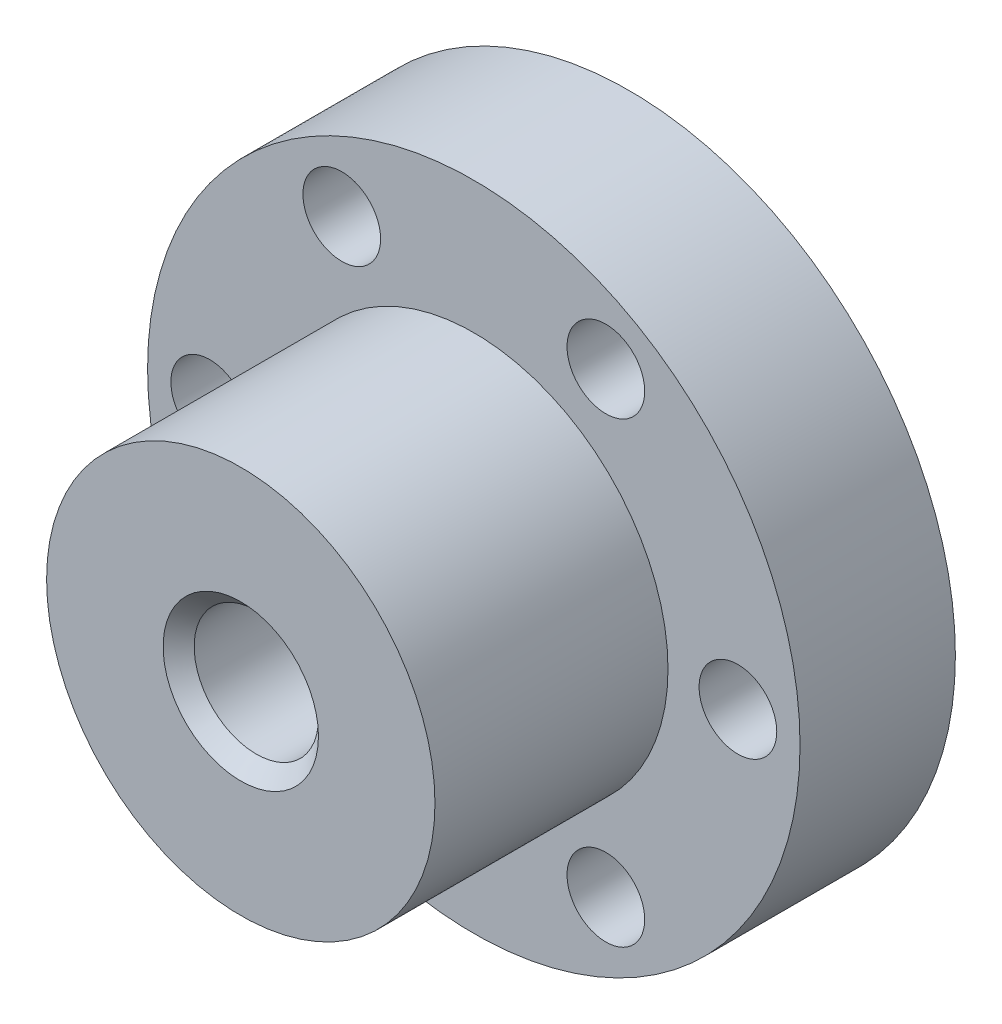
ISO-10303-21;
HEADER;
FILE_DESCRIPTION(('STEP AP214'),'2;1');
FILE_NAME('part.step','',(''),(''),'','','');
FILE_SCHEMA(('AUTOMOTIVE_DESIGN { 1 0 10303 214 1 1 1 1 }'));
ENDSEC;
DATA;
#1=APPLICATION_CONTEXT('core data for automotive mechanical design processes');
#2=APPLICATION_PROTOCOL_DEFINITION('international standard','automotive_design',2000,#1);
#3=PRODUCT_CONTEXT('',#1,'mechanical');
#4=PRODUCT('Part','Part','',(#3));
#5=PRODUCT_RELATED_PRODUCT_CATEGORY('part','',(#4));
#6=PRODUCT_DEFINITION_FORMATION('','',#4);
#7=PRODUCT_DEFINITION_CONTEXT('part definition',#1,'design');
#8=PRODUCT_DEFINITION('design','',#6,#7);
#9=PRODUCT_DEFINITION_SHAPE('','',#8);
#10=(LENGTH_UNIT() NAMED_UNIT(*) SI_UNIT(.MILLI.,.METRE.));
#11=(NAMED_UNIT(*) PLANE_ANGLE_UNIT() SI_UNIT($,.RADIAN.));
#12=(NAMED_UNIT(*) SI_UNIT($,.STERADIAN.) SOLID_ANGLE_UNIT());
#13=UNCERTAINTY_MEASURE_WITH_UNIT(LENGTH_MEASURE(1.E-05),#10,'distance_accuracy_value','');
#14=(GEOMETRIC_REPRESENTATION_CONTEXT(3) GLOBAL_UNCERTAINTY_ASSIGNED_CONTEXT((#13)) GLOBAL_UNIT_ASSIGNED_CONTEXT((#10,
#11,#12)) REPRESENTATION_CONTEXT('',''));
#15=CARTESIAN_POINT('',(0.,0.,0.));
#16=DIRECTION('',(0.,0.,1.));
#17=DIRECTION('',(1.,0.,0.));
#18=AXIS2_PLACEMENT_3D('',#15,#16,#17);
#19=CARTESIAN_POINT('',(8.75,0.,25.));
#20=DIRECTION('',(0.,0.,1.));
#21=DIRECTION('',(1.,0.,0.));
#22=AXIS2_PLACEMENT_3D('',#19,#20,#21);
#23=PLANE('',#22);
#24=CARTESIAN_POINT('',(0.,0.,24.9999999999773));
#25=DIRECTION('',(0.,0.,1.));
#26=DIRECTION('',(1.,0.,0.));
#27=AXIS2_PLACEMENT_3D('',#24,#25,#26);
#28=CIRCLE('',#27,4.99999999999545);
#29=CARTESIAN_POINT('',(4.99999999999545,0.,24.9999999999773));
#30=VERTEX_POINT('',#29);
#31=EDGE_CURVE('E15',#30,#30,#28,.F.);
#32=ORIENTED_EDGE('',*,*,#31,.T.);
#33=EDGE_LOOP('',(#32));
#34=FACE_BOUND('',#33,.T.);
#35=CARTESIAN_POINT('',(0.,0.,25.));
#36=DIRECTION('',(0.,0.,1.));
#37=DIRECTION('',(1.,0.,0.));
#38=AXIS2_PLACEMENT_3D('',#35,#36,#37);
#39=CIRCLE('',#38,12.5);
#40=CARTESIAN_POINT('',(12.5,0.,25.));
#41=VERTEX_POINT('',#40);
#42=EDGE_CURVE('E71',#41,#41,#39,.F.);
#43=ORIENTED_EDGE('',*,*,#42,.F.);
#44=EDGE_LOOP('',(#43));
#45=FACE_BOUND('',#44,.T.);
#46=ADVANCED_FACE('F12',(#34,#45),#23,.T.);
#47=CARTESIAN_POINT('',(0.,0.,24.9999999999773));
#48=DIRECTION('',(0.,0.,1.));
#49=DIRECTION('',(1.,0.,0.));
#50=AXIS2_PLACEMENT_3D('',#47,#48,#49);
#51=CONICAL_SURFACE('',#50,4.99999999999545,0.785398163397448);
#52=ORIENTED_EDGE('',*,*,#31,.F.);
#53=EDGE_LOOP('',(#52));
#54=FACE_BOUND('',#53,.T.);
#55=CARTESIAN_POINT('',(0.,0.,24.));
#56=DIRECTION('',(0.,0.,1.));
#57=DIRECTION('',(1.,0.,0.));
#58=AXIS2_PLACEMENT_3D('',#55,#56,#57);
#59=CIRCLE('',#58,4.);
#60=CARTESIAN_POINT('',(4.,0.,24.));
#61=VERTEX_POINT('',#60);
#62=EDGE_CURVE('E27',#61,#61,#59,.F.);
#63=ORIENTED_EDGE('',*,*,#62,.T.);
#64=EDGE_LOOP('',(#63));
#65=FACE_BOUND('',#64,.T.);
#66=ADVANCED_FACE('F81',(#54,#65),#51,.F.);
#67=CARTESIAN_POINT('',(0.,0.,17.5));
#68=DIRECTION('',(0.,0.,1.));
#69=DIRECTION('',(1.,0.,0.));
#70=AXIS2_PLACEMENT_3D('',#67,#68,#69);
#71=CYLINDRICAL_SURFACE('',#70,12.5);
#72=CARTESIAN_POINT('',(0.,0.,10.));
#73=DIRECTION('',(0.,0.,1.));
#74=DIRECTION('',(1.,0.,0.));
#75=AXIS2_PLACEMENT_3D('',#72,#73,#74);
#76=CIRCLE('',#75,12.5);
#77=CARTESIAN_POINT('',(12.5,0.,10.));
#78=VERTEX_POINT('',#77);
#79=EDGE_CURVE('E69',#78,#78,#76,.F.);
#80=ORIENTED_EDGE('',*,*,#79,.F.);
#81=EDGE_LOOP('',(#80));
#82=FACE_BOUND('',#81,.T.);
#83=ORIENTED_EDGE('',*,*,#42,.T.);
#84=EDGE_LOOP('',(#83));
#85=FACE_BOUND('',#84,.T.);
#86=ADVANCED_FACE('F84',(#82,#85),#71,.T.);
#87=CARTESIAN_POINT('',(0.,0.,12.5));
#88=DIRECTION('',(0.,0.,1.));
#89=DIRECTION('',(1.,0.,0.));
#90=AXIS2_PLACEMENT_3D('',#87,#88,#89);
#91=CYLINDRICAL_SURFACE('',#90,4.);
#92=ORIENTED_EDGE('',*,*,#62,.F.);
#93=EDGE_LOOP('',(#92));
#94=FACE_BOUND('',#93,.T.);
#95=CARTESIAN_POINT('',(0.,0.,1.0000000000332));
#96=DIRECTION('',(0.,0.,-1.));
#97=DIRECTION('',(1.,0.,0.));
#98=AXIS2_PLACEMENT_3D('',#95,#96,#97);
#99=CIRCLE('',#98,3.99999999996226);
#100=CARTESIAN_POINT('',(3.99999999996226,0.,1.0000000000332));
#101=VERTEX_POINT('',#100);
#102=EDGE_CURVE('E50',#101,#101,#99,.T.);
#103=ORIENTED_EDGE('',*,*,#102,.T.);
#104=EDGE_LOOP('',(#103));
#105=FACE_BOUND('',#104,.T.);
#106=ADVANCED_FACE('F87',(#94,#105),#91,.F.);
#107=CARTESIAN_POINT('',(16.75,0.,10.));
#108=DIRECTION('',(0.,0.,1.));
#109=DIRECTION('',(1.,0.,0.));
#110=AXIS2_PLACEMENT_3D('',#107,#108,#109);
#111=PLANE('',#110);
#112=ORIENTED_EDGE('',*,*,#79,.T.);
#113=EDGE_LOOP('',(#112));
#114=FACE_BOUND('',#113,.T.);
#115=CARTESIAN_POINT('',(0.,0.,10.));
#116=DIRECTION('',(0.,0.,1.));
#117=DIRECTION('',(1.,0.,0.));
#118=AXIS2_PLACEMENT_3D('',#115,#116,#117);
#119=CIRCLE('',#118,21.);
#120=CARTESIAN_POINT('',(21.,0.,10.));
#121=VERTEX_POINT('',#120);
#122=EDGE_CURVE('E47',#121,#121,#119,.F.);
#123=ORIENTED_EDGE('',*,*,#122,.F.);
#124=EDGE_LOOP('',(#123));
#125=FACE_BOUND('',#124,.T.);
#126=CARTESIAN_POINT('',(17.,0.,10.));
#127=DIRECTION('',(0.,0.,1.));
#128=DIRECTION('',(1.,0.,0.));
#129=AXIS2_PLACEMENT_3D('',#126,#127,#128);
#130=CIRCLE('',#129,2.5);
#131=CARTESIAN_POINT('',(19.5,0.,10.));
#132=VERTEX_POINT('',#131);
#133=EDGE_CURVE('E51',#132,#132,#130,.F.);
#134=ORIENTED_EDGE('',*,*,#133,.T.);
#135=EDGE_LOOP('',(#134));
#136=FACE_BOUND('',#135,.T.);
#137=CARTESIAN_POINT('',(8.5,14.7224318643355,10.));
#138=DIRECTION('',(0.,0.,1.));
#139=DIRECTION('',(1.,0.,0.));
#140=AXIS2_PLACEMENT_3D('',#137,#138,#139);
#141=CIRCLE('',#140,2.5);
#142=CARTESIAN_POINT('',(11.,14.7224318643355,10.));
#143=VERTEX_POINT('',#142);
#144=EDGE_CURVE('E54',#143,#143,#141,.F.);
#145=ORIENTED_EDGE('',*,*,#144,.T.);
#146=EDGE_LOOP('',(#145));
#147=FACE_BOUND('',#146,.T.);
#148=CARTESIAN_POINT('',(-8.5,14.7224318643355,10.));
#149=DIRECTION('',(0.,0.,1.));
#150=DIRECTION('',(1.,0.,0.));
#151=AXIS2_PLACEMENT_3D('',#148,#149,#150);
#152=CIRCLE('',#151,2.5);
#153=CARTESIAN_POINT('',(-6.,14.7224318643355,10.));
#154=VERTEX_POINT('',#153);
#155=EDGE_CURVE('E57',#154,#154,#152,.F.);
#156=ORIENTED_EDGE('',*,*,#155,.T.);
#157=EDGE_LOOP('',(#156));
#158=FACE_BOUND('',#157,.T.);
#159=CARTESIAN_POINT('',(-17.,0.,10.));
#160=DIRECTION('',(0.,0.,1.));
#161=DIRECTION('',(1.,0.,0.));
#162=AXIS2_PLACEMENT_3D('',#159,#160,#161);
#163=CIRCLE('',#162,2.5);
#164=CARTESIAN_POINT('',(-14.5,0.,10.));
#165=VERTEX_POINT('',#164);
#166=EDGE_CURVE('E60',#165,#165,#163,.F.);
#167=ORIENTED_EDGE('',*,*,#166,.T.);
#168=EDGE_LOOP('',(#167));
#169=FACE_BOUND('',#168,.T.);
#170=CARTESIAN_POINT('',(-8.50000000000001,-14.7224318643355,10.));
#171=DIRECTION('',(0.,0.,1.));
#172=DIRECTION('',(1.,0.,0.));
#173=AXIS2_PLACEMENT_3D('',#170,#171,#172);
#174=CIRCLE('',#173,2.5);
#175=CARTESIAN_POINT('',(-6.00000000000001,-14.7224318643355,10.));
#176=VERTEX_POINT('',#175);
#177=EDGE_CURVE('E63',#176,#176,#174,.F.);
#178=ORIENTED_EDGE('',*,*,#177,.T.);
#179=EDGE_LOOP('',(#178));
#180=FACE_BOUND('',#179,.T.);
#181=CARTESIAN_POINT('',(8.5,-14.7224318643355,10.));
#182=DIRECTION('',(0.,0.,1.));
#183=DIRECTION('',(1.,0.,0.));
#184=AXIS2_PLACEMENT_3D('',#181,#182,#183);
#185=CIRCLE('',#184,2.5);
#186=CARTESIAN_POINT('',(11.,-14.7224318643355,10.));
#187=VERTEX_POINT('',#186);
#188=EDGE_CURVE('E66',#187,#187,#185,.F.);
#189=ORIENTED_EDGE('',*,*,#188,.T.);
#190=EDGE_LOOP('',(#189));
#191=FACE_BOUND('',#190,.T.);
#192=ADVANCED_FACE('F90',(#114,#125,#136,#147,#158,#169,#180,#191),#111,.T.);
#193=CARTESIAN_POINT('',(8.5,-14.7224318643355,5.00000000000001));
#194=DIRECTION('',(0.,0.,1.));
#195=DIRECTION('',(1.,0.,0.));
#196=AXIS2_PLACEMENT_3D('',#193,#194,#195);
#197=CYLINDRICAL_SURFACE('',#196,2.5);
#198=CARTESIAN_POINT('',(8.5,-14.7224318643355,0.));
#199=DIRECTION('',(0.,0.,1.));
#200=DIRECTION('',(1.,0.,0.));
#201=AXIS2_PLACEMENT_3D('',#198,#199,#200);
#202=CIRCLE('',#201,2.5);
#203=CARTESIAN_POINT('',(11.,-14.7224318643355,0.));
#204=VERTEX_POINT('',#203);
#205=EDGE_CURVE('E44',#204,#204,#202,.T.);
#206=ORIENTED_EDGE('',*,*,#205,.F.);
#207=EDGE_LOOP('',(#206));
#208=FACE_BOUND('',#207,.T.);
#209=ORIENTED_EDGE('',*,*,#188,.F.);
#210=EDGE_LOOP('',(#209));
#211=FACE_BOUND('',#210,.T.);
#212=ADVANCED_FACE('F119',(#208,#211),#197,.F.);
#213=CARTESIAN_POINT('',(-8.50000000000001,-14.7224318643355,5.));
#214=DIRECTION('',(0.,0.,1.));
#215=DIRECTION('',(1.,0.,0.));
#216=AXIS2_PLACEMENT_3D('',#213,#214,#215);
#217=CYLINDRICAL_SURFACE('',#216,2.5);
#218=CARTESIAN_POINT('',(-8.50000000000001,-14.7224318643355,0.));
#219=DIRECTION('',(0.,0.,1.));
#220=DIRECTION('',(1.,0.,0.));
#221=AXIS2_PLACEMENT_3D('',#218,#219,#220);
#222=CIRCLE('',#221,2.5);
#223=CARTESIAN_POINT('',(-6.00000000000001,-14.7224318643355,0.));
#224=VERTEX_POINT('',#223);
#225=EDGE_CURVE('E41',#224,#224,#222,.T.);
#226=ORIENTED_EDGE('',*,*,#225,.F.);
#227=EDGE_LOOP('',(#226));
#228=FACE_BOUND('',#227,.T.);
#229=ORIENTED_EDGE('',*,*,#177,.F.);
#230=EDGE_LOOP('',(#229));
#231=FACE_BOUND('',#230,.T.);
#232=ADVANCED_FACE('F122',(#228,#231),#217,.F.);
#233=CARTESIAN_POINT('',(-17.,0.,5.));
#234=DIRECTION('',(0.,0.,1.));
#235=DIRECTION('',(1.,0.,0.));
#236=AXIS2_PLACEMENT_3D('',#233,#234,#235);
#237=CYLINDRICAL_SURFACE('',#236,2.5);
#238=CARTESIAN_POINT('',(-17.,0.,0.));
#239=DIRECTION('',(0.,0.,1.));
#240=DIRECTION('',(1.,0.,0.));
#241=AXIS2_PLACEMENT_3D('',#238,#239,#240);
#242=CIRCLE('',#241,2.5);
#243=CARTESIAN_POINT('',(-14.5,0.,0.));
#244=VERTEX_POINT('',#243);
#245=EDGE_CURVE('E38',#244,#244,#242,.T.);
#246=ORIENTED_EDGE('',*,*,#245,.F.);
#247=EDGE_LOOP('',(#246));
#248=FACE_BOUND('',#247,.T.);
#249=ORIENTED_EDGE('',*,*,#166,.F.);
#250=EDGE_LOOP('',(#249));
#251=FACE_BOUND('',#250,.T.);
#252=ADVANCED_FACE('F171',(#248,#251),#237,.F.);
#253=CARTESIAN_POINT('',(-8.5,14.7224318643355,5.00000000000001));
#254=DIRECTION('',(0.,0.,1.));
#255=DIRECTION('',(1.,0.,0.));
#256=AXIS2_PLACEMENT_3D('',#253,#254,#255);
#257=CYLINDRICAL_SURFACE('',#256,2.5);
#258=CARTESIAN_POINT('',(-8.5,14.7224318643355,0.));
#259=DIRECTION('',(0.,0.,1.));
#260=DIRECTION('',(1.,0.,0.));
#261=AXIS2_PLACEMENT_3D('',#258,#259,#260);
#262=CIRCLE('',#261,2.5);
#263=CARTESIAN_POINT('',(-6.,14.7224318643355,0.));
#264=VERTEX_POINT('',#263);
#265=EDGE_CURVE('E35',#264,#264,#262,.T.);
#266=ORIENTED_EDGE('',*,*,#265,.F.);
#267=EDGE_LOOP('',(#266));
#268=FACE_BOUND('',#267,.T.);
#269=ORIENTED_EDGE('',*,*,#155,.F.);
#270=EDGE_LOOP('',(#269));
#271=FACE_BOUND('',#270,.T.);
#272=ADVANCED_FACE('F180',(#268,#271),#257,.F.);
#273=CARTESIAN_POINT('',(8.5,14.7224318643355,5.));
#274=DIRECTION('',(0.,0.,1.));
#275=DIRECTION('',(1.,0.,0.));
#276=AXIS2_PLACEMENT_3D('',#273,#274,#275);
#277=CYLINDRICAL_SURFACE('',#276,2.5);
#278=CARTESIAN_POINT('',(8.5,14.7224318643355,0.));
#279=DIRECTION('',(0.,0.,1.));
#280=DIRECTION('',(1.,0.,0.));
#281=AXIS2_PLACEMENT_3D('',#278,#279,#280);
#282=CIRCLE('',#281,2.5);
#283=CARTESIAN_POINT('',(11.,14.7224318643355,0.));
#284=VERTEX_POINT('',#283);
#285=EDGE_CURVE('E32',#284,#284,#282,.T.);
#286=ORIENTED_EDGE('',*,*,#285,.F.);
#287=EDGE_LOOP('',(#286));
#288=FACE_BOUND('',#287,.T.);
#289=ORIENTED_EDGE('',*,*,#144,.F.);
#290=EDGE_LOOP('',(#289));
#291=FACE_BOUND('',#290,.T.);
#292=ADVANCED_FACE('F190',(#288,#291),#277,.F.);
#293=CARTESIAN_POINT('',(17.,0.,5.));
#294=DIRECTION('',(0.,0.,1.));
#295=DIRECTION('',(1.,0.,0.));
#296=AXIS2_PLACEMENT_3D('',#293,#294,#295);
#297=CYLINDRICAL_SURFACE('',#296,2.5);
#298=CARTESIAN_POINT('',(17.,0.,0.));
#299=DIRECTION('',(0.,0.,1.));
#300=DIRECTION('',(1.,0.,0.));
#301=AXIS2_PLACEMENT_3D('',#298,#299,#300);
#302=CIRCLE('',#301,2.5);
#303=CARTESIAN_POINT('',(19.5,0.,0.));
#304=VERTEX_POINT('',#303);
#305=EDGE_CURVE('E24',#304,#304,#302,.T.);
#306=ORIENTED_EDGE('',*,*,#305,.F.);
#307=EDGE_LOOP('',(#306));
#308=FACE_BOUND('',#307,.T.);
#309=ORIENTED_EDGE('',*,*,#133,.F.);
#310=EDGE_LOOP('',(#309));
#311=FACE_BOUND('',#310,.T.);
#312=ADVANCED_FACE('F99',(#308,#311),#297,.F.);
#313=CARTESIAN_POINT('',(0.,0.,0.));
#314=DIRECTION('',(0.,0.,-1.));
#315=DIRECTION('',(-1.,0.,0.));
#316=AXIS2_PLACEMENT_3D('',#313,#314,#315);
#317=CONICAL_SURFACE('',#316,4.99999999999545,0.785398163397448);
#318=ORIENTED_EDGE('',*,*,#102,.F.);
#319=EDGE_LOOP('',(#318));
#320=FACE_BOUND('',#319,.T.);
#321=CARTESIAN_POINT('',(0.,0.,0.));
#322=DIRECTION('',(0.,0.,-1.));
#323=DIRECTION('',(-1.,0.,0.));
#324=AXIS2_PLACEMENT_3D('',#321,#322,#323);
#325=CIRCLE('',#324,4.99999999999545);
#326=CARTESIAN_POINT('',(-4.99999999999545,0.,0.));
#327=VERTEX_POINT('',#326);
#328=EDGE_CURVE('E19',#327,#327,#325,.F.);
#329=ORIENTED_EDGE('',*,*,#328,.F.);
#330=EDGE_LOOP('',(#329));
#331=FACE_BOUND('',#330,.T.);
#332=ADVANCED_FACE('F95',(#320,#331),#317,.F.);
#333=CARTESIAN_POINT('',(0.,0.,5.));
#334=DIRECTION('',(0.,0.,1.));
#335=DIRECTION('',(1.,0.,0.));
#336=AXIS2_PLACEMENT_3D('',#333,#334,#335);
#337=CYLINDRICAL_SURFACE('',#336,21.);
#338=CARTESIAN_POINT('',(0.,0.,0.));
#339=DIRECTION('',(0.,0.,1.));
#340=DIRECTION('',(1.,0.,0.));
#341=AXIS2_PLACEMENT_3D('',#338,#339,#340);
#342=CIRCLE('',#341,21.);
#343=CARTESIAN_POINT('',(21.,0.,0.));
#344=VERTEX_POINT('',#343);
#345=EDGE_CURVE('E8',#344,#344,#342,.F.);
#346=ORIENTED_EDGE('',*,*,#345,.F.);
#347=EDGE_LOOP('',(#346));
#348=FACE_BOUND('',#347,.T.);
#349=ORIENTED_EDGE('',*,*,#122,.T.);
#350=EDGE_LOOP('',(#349));
#351=FACE_BOUND('',#350,.T.);
#352=ADVANCED_FACE('F98',(#348,#351),#337,.T.);
#353=CARTESIAN_POINT('',(13.,0.,0.));
#354=DIRECTION('',(0.,0.,-1.));
#355=DIRECTION('',(-1.,0.,0.));
#356=AXIS2_PLACEMENT_3D('',#353,#354,#355);
#357=PLANE('',#356);
#358=ORIENTED_EDGE('',*,*,#345,.T.);
#359=EDGE_LOOP('',(#358));
#360=FACE_BOUND('',#359,.T.);
#361=ORIENTED_EDGE('',*,*,#328,.T.);
#362=EDGE_LOOP('',(#361));
#363=FACE_BOUND('',#362,.T.);
#364=ORIENTED_EDGE('',*,*,#305,.T.);
#365=EDGE_LOOP('',(#364));
#366=FACE_BOUND('',#365,.T.);
#367=ORIENTED_EDGE('',*,*,#285,.T.);
#368=EDGE_LOOP('',(#367));
#369=FACE_BOUND('',#368,.T.);
#370=ORIENTED_EDGE('',*,*,#265,.T.);
#371=EDGE_LOOP('',(#370));
#372=FACE_BOUND('',#371,.T.);
#373=ORIENTED_EDGE('',*,*,#245,.T.);
#374=EDGE_LOOP('',(#373));
#375=FACE_BOUND('',#374,.T.);
#376=ORIENTED_EDGE('',*,*,#225,.T.);
#377=EDGE_LOOP('',(#376));
#378=FACE_BOUND('',#377,.T.);
#379=ORIENTED_EDGE('',*,*,#205,.T.);
#380=EDGE_LOOP('',(#379));
#381=FACE_BOUND('',#380,.T.);
#382=ADVANCED_FACE('F103',(#360,#363,#366,#369,#372,#375,#378,#381),#357,.T.);
#383=CLOSED_SHELL('',(#46,#66,#86,#106,#192,#212,#232,#252,#272,#292,#312,#332,#352,#382));
#384=MANIFOLD_SOLID_BREP('B1',#383);
#385=ADVANCED_BREP_SHAPE_REPRESENTATION('',(#18,#384),#14);
#386=SHAPE_DEFINITION_REPRESENTATION(#9,#385);
ENDSEC;
END-ISO-10303-21;
